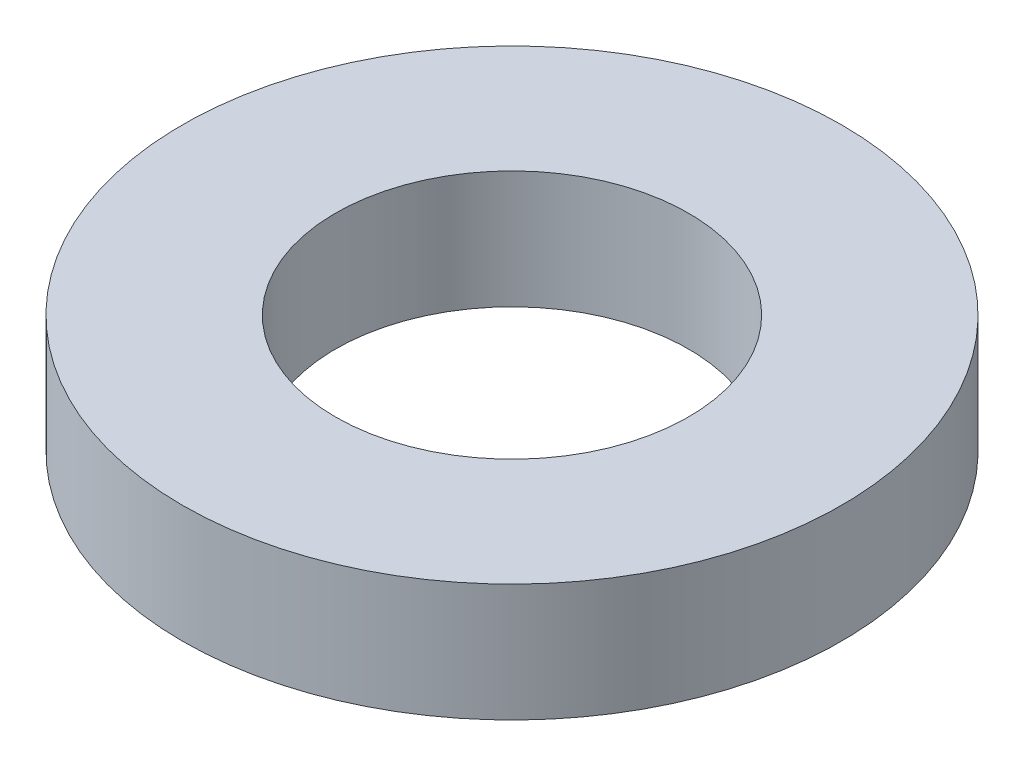
ISO-10303-21;
HEADER;
FILE_DESCRIPTION(('STEP AP214'),'2;1');
FILE_NAME('part.step','',(''),(''),'','','');
FILE_SCHEMA(('AUTOMOTIVE_DESIGN { 1 0 10303 214 1 1 1 1 }'));
ENDSEC;
DATA;
#1=APPLICATION_CONTEXT('core data for automotive mechanical design processes');
#2=APPLICATION_PROTOCOL_DEFINITION('international standard','automotive_design',2000,#1);
#3=PRODUCT_CONTEXT('',#1,'mechanical');
#4=PRODUCT('Part','Part','',(#3));
#5=PRODUCT_RELATED_PRODUCT_CATEGORY('part','',(#4));
#6=PRODUCT_DEFINITION_FORMATION('','',#4);
#7=PRODUCT_DEFINITION_CONTEXT('part definition',#1,'design');
#8=PRODUCT_DEFINITION('design','',#6,#7);
#9=PRODUCT_DEFINITION_SHAPE('','',#8);
#10=(LENGTH_UNIT() NAMED_UNIT(*) SI_UNIT(.MILLI.,.METRE.));
#11=(NAMED_UNIT(*) PLANE_ANGLE_UNIT() SI_UNIT($,.RADIAN.));
#12=(NAMED_UNIT(*) SI_UNIT($,.STERADIAN.) SOLID_ANGLE_UNIT());
#13=UNCERTAINTY_MEASURE_WITH_UNIT(LENGTH_MEASURE(1.E-05),#10,'distance_accuracy_value','');
#14=(GEOMETRIC_REPRESENTATION_CONTEXT(3) GLOBAL_UNCERTAINTY_ASSIGNED_CONTEXT((#13)) GLOBAL_UNIT_ASSIGNED_CONTEXT((#10,
#11,#12)) REPRESENTATION_CONTEXT('',''));
#15=CARTESIAN_POINT('',(0.,0.,0.));
#16=DIRECTION('',(0.,0.,1.));
#17=DIRECTION('',(1.,0.,0.));
#18=AXIS2_PLACEMENT_3D('',#15,#16,#17);
#19=CARTESIAN_POINT('',(0.,1.,0.));
#20=DIRECTION('',(0.,1.,0.));
#21=DIRECTION('',(0.,0.,1.));
#22=AXIS2_PLACEMENT_3D('',#19,#20,#21);
#23=PLANE('',#22);
#24=CARTESIAN_POINT('',(0.,1.,0.));
#25=DIRECTION('',(0.,1.,0.));
#26=DIRECTION('',(0.,0.,1.));
#27=AXIS2_PLACEMENT_3D('',#24,#25,#26);
#28=CIRCLE('',#27,2.8);
#29=CARTESIAN_POINT('',(0.,1.,2.8));
#30=VERTEX_POINT('',#29);
#31=EDGE_CURVE('E10',#30,#30,#28,.T.);
#32=ORIENTED_EDGE('',*,*,#31,.T.);
#33=EDGE_LOOP('',(#32));
#34=FACE_BOUND('',#33,.T.);
#35=CARTESIAN_POINT('',(0.,1.,0.));
#36=DIRECTION('',(0.,1.,0.));
#37=DIRECTION('',(0.,0.,1.));
#38=AXIS2_PLACEMENT_3D('',#35,#36,#37);
#39=CIRCLE('',#38,1.5);
#40=CARTESIAN_POINT('',(0.,1.,1.5));
#41=VERTEX_POINT('',#40);
#42=EDGE_CURVE('E42',#41,#41,#39,.T.);
#43=ORIENTED_EDGE('',*,*,#42,.F.);
#44=EDGE_LOOP('',(#43));
#45=FACE_BOUND('',#44,.T.);
#46=ADVANCED_FACE('F31',(#34,#45),#23,.T.);
#47=CARTESIAN_POINT('',(0.,0.,0.));
#48=DIRECTION('',(0.,1.,0.));
#49=DIRECTION('',(0.,0.,1.));
#50=AXIS2_PLACEMENT_3D('',#47,#48,#49);
#51=PLANE('',#50);
#52=CARTESIAN_POINT('',(0.,0.,0.));
#53=DIRECTION('',(0.,1.,0.));
#54=DIRECTION('',(0.,0.,1.));
#55=AXIS2_PLACEMENT_3D('',#52,#53,#54);
#56=CIRCLE('',#55,2.8);
#57=CARTESIAN_POINT('',(0.,0.,2.8));
#58=VERTEX_POINT('',#57);
#59=EDGE_CURVE('E35',#58,#58,#56,.T.);
#60=ORIENTED_EDGE('',*,*,#59,.F.);
#61=EDGE_LOOP('',(#60));
#62=FACE_BOUND('',#61,.T.);
#63=CARTESIAN_POINT('',(0.,0.,0.));
#64=DIRECTION('',(0.,1.,0.));
#65=DIRECTION('',(0.,0.,1.));
#66=AXIS2_PLACEMENT_3D('',#63,#64,#65);
#67=CIRCLE('',#66,1.5);
#68=CARTESIAN_POINT('',(0.,0.,1.5));
#69=VERTEX_POINT('',#68);
#70=EDGE_CURVE('E44',#69,#69,#67,.T.);
#71=ORIENTED_EDGE('',*,*,#70,.T.);
#72=EDGE_LOOP('',(#71));
#73=FACE_BOUND('',#72,.T.);
#74=ADVANCED_FACE('F54',(#62,#73),#51,.F.);
#75=CARTESIAN_POINT('',(0.,1.,0.));
#76=DIRECTION('',(0.,-1.,0.));
#77=DIRECTION('',(0.,0.,-1.));
#78=AXIS2_PLACEMENT_3D('',#75,#76,#77);
#79=CYLINDRICAL_SURFACE('',#78,2.8);
#80=ORIENTED_EDGE('',*,*,#31,.F.);
#81=EDGE_LOOP('',(#80));
#82=FACE_BOUND('',#81,.T.);
#83=ORIENTED_EDGE('',*,*,#59,.T.);
#84=EDGE_LOOP('',(#83));
#85=FACE_BOUND('',#84,.T.);
#86=ADVANCED_FACE('F33',(#82,#85),#79,.T.);
#87=CARTESIAN_POINT('',(0.,1.,0.));
#88=DIRECTION('',(0.,-1.,0.));
#89=DIRECTION('',(0.,0.,-1.));
#90=AXIS2_PLACEMENT_3D('',#87,#88,#89);
#91=CYLINDRICAL_SURFACE('',#90,1.5);
#92=ORIENTED_EDGE('',*,*,#42,.T.);
#93=EDGE_LOOP('',(#92));
#94=FACE_BOUND('',#93,.T.);
#95=ORIENTED_EDGE('',*,*,#70,.F.);
#96=EDGE_LOOP('',(#95));
#97=FACE_BOUND('',#96,.T.);
#98=ADVANCED_FACE('F50',(#94,#97),#91,.F.);
#99=CLOSED_SHELL('',(#46,#74,#86,#98));
#100=MANIFOLD_SOLID_BREP('B2',#99);
#101=ADVANCED_BREP_SHAPE_REPRESENTATION('',(#18,#100),#14);
#102=SHAPE_DEFINITION_REPRESENTATION(#9,#101);
ENDSEC;
END-ISO-10303-21;
